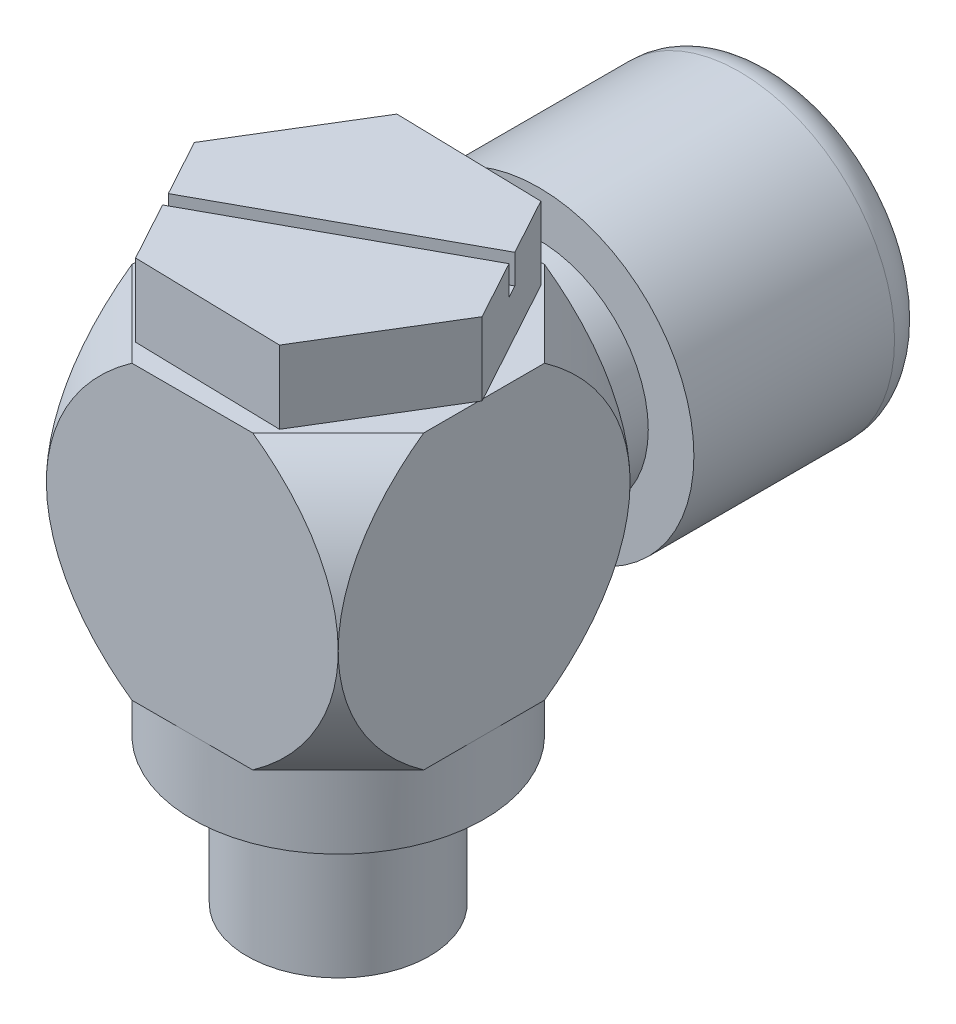
ISO-10303-21;
HEADER;
FILE_DESCRIPTION(('STEP AP214'),'2;1');
FILE_NAME('part.step','',(''),(''),'','','');
FILE_SCHEMA(('AUTOMOTIVE_DESIGN { 1 0 10303 214 1 1 1 1 }'));
ENDSEC;
DATA;
#1=APPLICATION_CONTEXT('core data for automotive mechanical design processes');
#2=APPLICATION_PROTOCOL_DEFINITION('international standard','automotive_design',2000,#1);
#3=PRODUCT_CONTEXT('',#1,'mechanical');
#4=PRODUCT('Part','Part','',(#3));
#5=PRODUCT_RELATED_PRODUCT_CATEGORY('part','',(#4));
#6=PRODUCT_DEFINITION_FORMATION('','',#4);
#7=PRODUCT_DEFINITION_CONTEXT('part definition',#1,'design');
#8=PRODUCT_DEFINITION('design','',#6,#7);
#9=PRODUCT_DEFINITION_SHAPE('','',#8);
#10=(LENGTH_UNIT() NAMED_UNIT(*) SI_UNIT(.MILLI.,.METRE.));
#11=(NAMED_UNIT(*) PLANE_ANGLE_UNIT() SI_UNIT($,.RADIAN.));
#12=(NAMED_UNIT(*) SI_UNIT($,.STERADIAN.) SOLID_ANGLE_UNIT());
#13=UNCERTAINTY_MEASURE_WITH_UNIT(LENGTH_MEASURE(1.E-05),#10,'distance_accuracy_value','');
#14=(GEOMETRIC_REPRESENTATION_CONTEXT(3) GLOBAL_UNCERTAINTY_ASSIGNED_CONTEXT((#13)) GLOBAL_UNIT_ASSIGNED_CONTEXT((#10,
#11,#12)) REPRESENTATION_CONTEXT('',''));
#15=CARTESIAN_POINT('',(0.,0.,0.));
#16=DIRECTION('',(0.,0.,1.));
#17=DIRECTION('',(1.,0.,0.));
#18=AXIS2_PLACEMENT_3D('',#15,#16,#17);
#19=CARTESIAN_POINT('',(1.35007971637512,-3.43907363420428,7.64251311566957));
#20=DIRECTION('',(0.,1.,0.));
#21=DIRECTION('',(0.,0.,1.));
#22=AXIS2_PLACEMENT_3D('',#19,#20,#21);
#23=PLANE('',#22);
#24=DIRECTION('',(0.877617924580816,0.,-0.479360801958672));
#25=VECTOR('',#24,1.);
#26=CARTESIAN_POINT('',(-1.47617054158178,-3.43907363420428,2.46818956731241));
#27=LINE('',#26,#25);
#28=CARTESIAN_POINT('',(-7.61949601364746,-3.43907363420428,5.8237151810231));
#29=VERTEX_POINT('',#28);
#30=CARTESIAN_POINT('',(-1.47617054158178,-3.43907363420428,2.46818956731241));
#31=VERTEX_POINT('',#30);
#32=EDGE_CURVE('E40',#29,#31,#27,.T.);
#33=ORIENTED_EDGE('',*,*,#32,.F.);
#34=DIRECTION('',(0.479360801958672,0.,0.877617924580816));
#35=VECTOR('',#34,1.);
#36=CARTESIAN_POINT('',(-8.66787298838766,-3.43907363420428,3.90433749934705));
#37=LINE('',#36,#35);
#38=CARTESIAN_POINT('',(-6.73055937203911,-3.43907363420428,7.45118811436365));
#39=VERTEX_POINT('',#38);
#40=EDGE_CURVE('E229',#29,#39,#37,.T.);
#41=ORIENTED_EDGE('',*,*,#40,.T.);
#42=DIRECTION('',(0.999719818482898,0.,0.0236703302157165));
#43=VECTOR('',#42,1.);
#44=CARTESIAN_POINT('',(-6.73055937203911,-3.43907363420428,7.45118811436365));
#45=LINE('',#44,#43);
#46=CARTESIAN_POINT('',(-2.690239827832,-3.43907363420428,7.54685061501661));
#47=VERTEX_POINT('',#46);
#48=EDGE_CURVE('E366',#39,#47,#45,.T.);
#49=ORIENTED_EDGE('',*,*,#48,.T.);
#50=DIRECTION('',(0.520359016524226,0.,-0.853947594365099));
#51=VECTOR('',#50,1.);
#52=CARTESIAN_POINT('',(-2.690239827832,-3.43907363420428,7.54685061501661));
#53=LINE('',#52,#51);
#54=CARTESIAN_POINT('',(-0.587233899973428,-3.43907363420428,4.09566250065296));
#55=VERTEX_POINT('',#54);
#56=EDGE_CURVE('E359',#47,#55,#53,.T.);
#57=ORIENTED_EDGE('',*,*,#56,.T.);
#58=DIRECTION('',(-0.479360801958672,0.,-0.877617924580816));
#59=VECTOR('',#58,1.);
#60=CARTESIAN_POINT('',(-0.587233899973428,-3.43907363420428,4.09566250065296));
#61=LINE('',#60,#59);
#62=EDGE_CURVE('E355',#55,#31,#61,.T.);
#63=ORIENTED_EDGE('',*,*,#62,.T.);
#64=EDGE_LOOP('',(#33,#41,#49,#57,#63));
#65=FACE_BOUND('',#64,.T.);
#66=ADVANCED_FACE('F32',(#65),#23,.T.);
#67=CARTESIAN_POINT('',(-8.62755344418053,-13.4390736342043,0.));
#68=DIRECTION('',(0.,0.,1.));
#69=DIRECTION('',(1.,0.,0.));
#70=AXIS2_PLACEMENT_3D('',#67,#68,#69);
#71=PLANE('',#70);
#72=CARTESIAN_POINT('',(-8.62755344418049,-9.43907363420428,0.));
#73=DIRECTION('',(0.,0.,1.));
#74=DIRECTION('',(1.,0.,0.));
#75=AXIS2_PLACEMENT_3D('',#72,#73,#74);
#76=ELLIPSE('',#75,7.99999999999995,5.65685424949235);
#77=CARTESIAN_POINT('',(-0.627553444180534,-9.43907363420428,0.));
#78=VERTEX_POINT('',#77);
#79=CARTESIAN_POINT('',(-2.97069919468817,-5.43907363420428,0.));
#80=VERTEX_POINT('',#79);
#81=EDGE_CURVE('E332',#78,#80,#76,.T.);
#82=ORIENTED_EDGE('',*,*,#81,.F.);
#83=CARTESIAN_POINT('',(-2.97069919468817,-13.4390736342043,0.));
#84=VERTEX_POINT('',#83);
#85=EDGE_CURVE('E329',#84,#78,#76,.T.);
#86=ORIENTED_EDGE('',*,*,#85,.F.);
#87=DIRECTION('',(1.,0.,0.));
#88=VECTOR('',#87,1.);
#89=CARTESIAN_POINT('',(-8.62755344418053,-13.4390736342043,0.));
#90=LINE('',#89,#88);
#91=CARTESIAN_POINT('',(-4.62755344418047,-13.4390736342043,0.));
#92=VERTEX_POINT('',#91);
#93=EDGE_CURVE('E296',#92,#84,#90,.T.);
#94=ORIENTED_EDGE('',*,*,#93,.F.);
#95=CARTESIAN_POINT('',(-6.28440769367293,-13.4390736342043,0.));
#96=VERTEX_POINT('',#95);
#97=EDGE_CURVE('E298',#96,#92,#90,.T.);
#98=ORIENTED_EDGE('',*,*,#97,.F.);
#99=CARTESIAN_POINT('',(-0.627553444180537,-9.43907363420428,0.));
#100=DIRECTION('',(0.,0.,1.));
#101=DIRECTION('',(1.,0.,0.));
#102=AXIS2_PLACEMENT_3D('',#99,#100,#101);
#103=ELLIPSE('',#102,8.,5.65685424949239);
#104=CARTESIAN_POINT('',(-8.62755344418054,-9.43907363420428,0.));
#105=VERTEX_POINT('',#104);
#106=EDGE_CURVE('E326',#105,#96,#103,.T.);
#107=ORIENTED_EDGE('',*,*,#106,.F.);
#108=CARTESIAN_POINT('',(-6.28440769367293,-5.43907363420428,0.));
#109=VERTEX_POINT('',#108);
#110=EDGE_CURVE('E328',#109,#105,#103,.T.);
#111=ORIENTED_EDGE('',*,*,#110,.F.);
#112=DIRECTION('',(-1.,0.,0.));
#113=VECTOR('',#112,1.);
#114=CARTESIAN_POINT('',(-8.62755344418053,-5.43907363420428,0.));
#115=LINE('',#114,#113);
#116=EDGE_CURVE('E300',#80,#109,#115,.T.);
#117=ORIENTED_EDGE('',*,*,#116,.F.);
#118=EDGE_LOOP('',(#82,#86,#94,#98,#107,#111,#117));
#119=FACE_BOUND('',#118,.T.);
#120=CARTESIAN_POINT('',(-4.62755344418055,-9.43907363420428,0.));
#121=DIRECTION('',(0.,0.,1.));
#122=DIRECTION('',(1.,0.,0.));
#123=AXIS2_PLACEMENT_3D('',#120,#121,#122);
#124=CIRCLE('',#123,3.);
#125=CARTESIAN_POINT('',(-1.62755344418055,-9.43907363420428,0.));
#126=VERTEX_POINT('',#125);
#127=EDGE_CURVE('E333',#126,#126,#124,.F.);
#128=ORIENTED_EDGE('',*,*,#127,.F.);
#129=EDGE_LOOP('',(#128));
#130=FACE_BOUND('',#129,.T.);
#131=ADVANCED_FACE('F446',(#119,#130),#71,.F.);
#132=CARTESIAN_POINT('',(-4.62755344418047,-15.4390736342043,4.00000000000008));
#133=DIRECTION('',(0.,-1.,0.));
#134=DIRECTION('',(0.,0.,-1.));
#135=AXIS2_PLACEMENT_3D('',#132,#133,#134);
#136=PLANE('',#135);
#137=CARTESIAN_POINT('',(-4.62755344418047,-15.4390736342043,4.00000000000008));
#138=DIRECTION('',(0.,-1.,0.));
#139=DIRECTION('',(0.,0.,-1.));
#140=AXIS2_PLACEMENT_3D('',#137,#138,#139);
#141=CIRCLE('',#140,4.00000000000011);
#142=CARTESIAN_POINT('',(-4.62755344418047,-15.4390736342043,0.));
#143=VERTEX_POINT('',#142);
#144=EDGE_CURVE('E390',#143,#143,#141,.T.);
#145=ORIENTED_EDGE('',*,*,#144,.T.);
#146=EDGE_LOOP('',(#145));
#147=FACE_BOUND('',#146,.T.);
#148=CARTESIAN_POINT('',(-4.62755344418047,-15.4390736342043,4.00000000000008));
#149=DIRECTION('',(0.,-1.,0.));
#150=DIRECTION('',(0.,0.,-1.));
#151=AXIS2_PLACEMENT_3D('',#148,#149,#150);
#152=CIRCLE('',#151,2.5);
#153=CARTESIAN_POINT('',(-4.62755344418047,-15.4390736342043,1.50000000000008));
#154=VERTEX_POINT('',#153);
#155=EDGE_CURVE('E400',#154,#154,#152,.T.);
#156=ORIENTED_EDGE('',*,*,#155,.F.);
#157=EDGE_LOOP('',(#156));
#158=FACE_BOUND('',#157,.T.);
#159=ADVANCED_FACE('F540',(#147,#158),#136,.T.);
#160=CARTESIAN_POINT('',(-8.62755344418053,-13.4390736342043,8.));
#161=DIRECTION('',(0.,1.,0.));
#162=DIRECTION('',(0.,0.,1.));
#163=AXIS2_PLACEMENT_3D('',#160,#161,#162);
#164=PLANE('',#163);
#165=CARTESIAN_POINT('',(-4.62755344418047,-13.4390736342043,4.00000000000008));
#166=DIRECTION('',(0.,-1.,0.));
#167=DIRECTION('',(0.,0.,-1.));
#168=AXIS2_PLACEMENT_3D('',#165,#166,#167);
#169=CIRCLE('',#168,4.00000000000011);
#170=CARTESIAN_POINT('',(-1.79912631943428,-13.4390736342043,1.17157287525389));
#171=VERTEX_POINT('',#170);
#172=EDGE_CURVE('E393',#92,#171,#169,.T.);
#173=ORIENTED_EDGE('',*,*,#172,.F.);
#174=ORIENTED_EDGE('',*,*,#93,.T.);
#175=DIRECTION('',(0.707106781186547,0.,0.707106781186548));
#176=VECTOR('',#175,1.);
#177=CARTESIAN_POINT('',(-8.16308735011327,-13.4390736342043,-5.19238815542511));
#178=LINE('',#177,#176);
#179=EDGE_CURVE('E255',#171,#84,#178,.F.);
#180=ORIENTED_EDGE('',*,*,#179,.F.);
#181=EDGE_LOOP('',(#173,#174,#180));
#182=FACE_BOUND('',#181,.T.);
#183=ADVANCED_FACE('F487',(#182),#164,.F.);
#184=CARTESIAN_POINT('',(-0.627553444180535,-13.4390736342043,4.00000000000008));
#185=VERTEX_POINT('',#184);
#186=EDGE_CURVE('E337',#171,#185,#169,.T.);
#187=ORIENTED_EDGE('',*,*,#186,.F.);
#188=CARTESIAN_POINT('',(-0.627553444180536,-13.4390736342043,2.34314575050763));
#189=VERTEX_POINT('',#188);
#190=EDGE_CURVE('E257',#189,#171,#178,.F.);
#191=ORIENTED_EDGE('',*,*,#190,.F.);
#192=DIRECTION('',(0.,0.,-1.));
#193=VECTOR('',#192,1.);
#194=CARTESIAN_POINT('',(-0.627553444180535,-13.4390736342043,8.));
#195=LINE('',#194,#193);
#196=EDGE_CURVE('E317',#185,#189,#195,.T.);
#197=ORIENTED_EDGE('',*,*,#196,.F.);
#198=EDGE_LOOP('',(#187,#191,#197));
#199=FACE_BOUND('',#198,.T.);
#200=ADVANCED_FACE('F484',(#199),#164,.F.);
#201=CARTESIAN_POINT('',(-1.79912631943433,-13.4390736342043,6.82842712474621));
#202=VERTEX_POINT('',#201);
#203=EDGE_CURVE('E476',#185,#202,#169,.T.);
#204=ORIENTED_EDGE('',*,*,#203,.F.);
#205=CARTESIAN_POINT('',(-0.627553444180535,-13.4390736342043,5.65685424949241));
#206=VERTEX_POINT('',#205);
#207=EDGE_CURVE('E319',#206,#185,#195,.T.);
#208=ORIENTED_EDGE('',*,*,#207,.F.);
#209=DIRECTION('',(0.707106781186546,0.,-0.707106781186549));
#210=VECTOR('',#209,1.);
#211=CARTESIAN_POINT('',(-8.16308735011325,-13.4390736342043,13.1923881554252));
#212=LINE('',#211,#210);
#213=EDGE_CURVE('E297',#202,#206,#212,.T.);
#214=ORIENTED_EDGE('',*,*,#213,.F.);
#215=EDGE_LOOP('',(#204,#208,#214));
#216=FACE_BOUND('',#215,.T.);
#217=ADVANCED_FACE('F501',(#216),#164,.F.);
#218=CARTESIAN_POINT('',(-4.62755344418047,-13.4390736342043,8.));
#219=VERTEX_POINT('',#218);
#220=EDGE_CURVE('E475',#202,#219,#169,.T.);
#221=ORIENTED_EDGE('',*,*,#220,.F.);
#222=CARTESIAN_POINT('',(-2.97069919468812,-13.4390736342043,8.));
#223=VERTEX_POINT('',#222);
#224=EDGE_CURVE('E293',#223,#202,#212,.T.);
#225=ORIENTED_EDGE('',*,*,#224,.F.);
#226=DIRECTION('',(1.,0.,0.));
#227=VECTOR('',#226,1.);
#228=CARTESIAN_POINT('',(-8.62755344418053,-13.4390736342043,8.));
#229=LINE('',#228,#227);
#230=EDGE_CURVE('E302',#219,#223,#229,.T.);
#231=ORIENTED_EDGE('',*,*,#230,.F.);
#232=EDGE_LOOP('',(#221,#225,#231));
#233=FACE_BOUND('',#232,.T.);
#234=ADVANCED_FACE('F507',(#233),#164,.F.);
#235=CARTESIAN_POINT('',(-7.45598056892661,-13.4390736342043,6.82842712474621));
#236=VERTEX_POINT('',#235);
#237=EDGE_CURVE('E55',#219,#236,#169,.T.);
#238=ORIENTED_EDGE('',*,*,#237,.F.);
#239=CARTESIAN_POINT('',(-6.28440769367283,-13.4390736342043,8.));
#240=VERTEX_POINT('',#239);
#241=EDGE_CURVE('E303',#240,#219,#229,.T.);
#242=ORIENTED_EDGE('',*,*,#241,.F.);
#243=DIRECTION('',(0.707106781186547,0.,0.707106781186548));
#244=VECTOR('',#243,1.);
#245=CARTESIAN_POINT('',(-13.8199415996056,-13.4390736342043,0.46446609406721));
#246=LINE('',#245,#244);
#247=EDGE_CURVE('E266',#236,#240,#246,.T.);
#248=ORIENTED_EDGE('',*,*,#247,.F.);
#249=EDGE_LOOP('',(#238,#242,#248));
#250=FACE_BOUND('',#249,.T.);
#251=ADVANCED_FACE('F512',(#250),#164,.F.);
#252=CARTESIAN_POINT('',(-8.62755344418053,-13.4390736342043,4.00000000000008));
#253=VERTEX_POINT('',#252);
#254=EDGE_CURVE('E472',#236,#253,#169,.T.);
#255=ORIENTED_EDGE('',*,*,#254,.F.);
#256=CARTESIAN_POINT('',(-8.62755344418053,-13.4390736342043,5.65685424949229));
#257=VERTEX_POINT('',#256);
#258=EDGE_CURVE('E267',#257,#236,#246,.T.);
#259=ORIENTED_EDGE('',*,*,#258,.F.);
#260=DIRECTION('',(0.,0.,-1.));
#261=VECTOR('',#260,1.);
#262=CARTESIAN_POINT('',(-8.62755344418053,-13.4390736342043,8.));
#263=LINE('',#262,#261);
#264=EDGE_CURVE('E323',#257,#253,#263,.T.);
#265=ORIENTED_EDGE('',*,*,#264,.T.);
#266=EDGE_LOOP('',(#255,#259,#265));
#267=FACE_BOUND('',#266,.T.);
#268=ADVANCED_FACE('F471',(#267),#164,.F.);
#269=CARTESIAN_POINT('',(-7.45598056892675,-13.4390736342043,1.17157287525382));
#270=VERTEX_POINT('',#269);
#271=EDGE_CURVE('E462',#253,#270,#169,.T.);
#272=ORIENTED_EDGE('',*,*,#271,.F.);
#273=CARTESIAN_POINT('',(-8.62755344418053,-13.4390736342043,2.34314575050761));
#274=VERTEX_POINT('',#273);
#275=EDGE_CURVE('E322',#253,#274,#263,.T.);
#276=ORIENTED_EDGE('',*,*,#275,.T.);
#277=DIRECTION('',(0.707106781186546,0.,-0.707106781186549));
#278=VECTOR('',#277,1.);
#279=CARTESIAN_POINT('',(-13.8199415996057,-13.4390736342043,7.53553390593276));
#280=LINE('',#279,#278);
#281=EDGE_CURVE('E276',#270,#274,#280,.F.);
#282=ORIENTED_EDGE('',*,*,#281,.F.);
#283=EDGE_LOOP('',(#272,#276,#282));
#284=FACE_BOUND('',#283,.T.);
#285=ADVANCED_FACE('F465',(#284),#164,.F.);
#286=EDGE_CURVE('E397',#270,#92,#169,.T.);
#287=ORIENTED_EDGE('',*,*,#286,.F.);
#288=EDGE_CURVE('E277',#96,#270,#280,.F.);
#289=ORIENTED_EDGE('',*,*,#288,.F.);
#290=ORIENTED_EDGE('',*,*,#97,.T.);
#291=EDGE_LOOP('',(#287,#289,#290));
#292=FACE_BOUND('',#291,.T.);
#293=ADVANCED_FACE('F458',(#292),#164,.F.);
#294=CARTESIAN_POINT('',(-8.62755344418053,-5.43907363420428,8.));
#295=DIRECTION('',(0.,-1.,0.));
#296=DIRECTION('',(0.,0.,-1.));
#297=AXIS2_PLACEMENT_3D('',#294,#295,#296);
#298=PLANE('',#297);
#299=DIRECTION('',(-0.520359016524226,0.,0.853947594365099));
#300=VECTOR('',#299,1.);
#301=CARTESIAN_POINT('',(-6.5648670605291,-5.43907363420428,0.453149384983397));
#302=LINE('',#301,#300);
#303=CARTESIAN_POINT('',(-6.5648670605291,-5.43907363420428,0.453149384983397));
#304=VERTEX_POINT('',#303);
#305=CARTESIAN_POINT('',(-8.62755344418053,-5.43907363420428,3.83817014817562));
#306=VERTEX_POINT('',#305);
#307=EDGE_CURVE('E371',#304,#306,#302,.T.);
#308=ORIENTED_EDGE('',*,*,#307,.F.);
#309=DIRECTION('',(-0.999719818482898,0.,-0.0236703302157167));
#310=VECTOR('',#309,1.);
#311=CARTESIAN_POINT('',(-2.52454751632198,-5.43907363420428,0.548811885636356));
#312=LINE('',#311,#310);
#313=CARTESIAN_POINT('',(-2.52454751632198,-5.43907363420428,0.548811885636356));
#314=VERTEX_POINT('',#313);
#315=EDGE_CURVE('E376',#314,#304,#312,.T.);
#316=ORIENTED_EDGE('',*,*,#315,.F.);
#317=DIRECTION('',(-0.479360801958672,0.,-0.877617924580816));
#318=VECTOR('',#317,1.);
#319=CARTESIAN_POINT('',(-0.587233899973428,-5.43907363420428,4.09566250065296));
#320=LINE('',#319,#318);
#321=CARTESIAN_POINT('',(-0.627553444180536,-5.43907363420428,4.02184512851385));
#322=VERTEX_POINT('',#321);
#323=EDGE_CURVE('E383',#322,#314,#320,.T.);
#324=ORIENTED_EDGE('',*,*,#323,.F.);
#325=DIRECTION('',(0.,0.,-1.));
#326=VECTOR('',#325,1.);
#327=CARTESIAN_POINT('',(-0.627553444180535,-5.43907363420428,8.));
#328=LINE('',#327,#326);
#329=CARTESIAN_POINT('',(-0.627553444180536,-5.43907363420428,2.34314575050763));
#330=VERTEX_POINT('',#329);
#331=EDGE_CURVE('E313',#322,#330,#328,.T.);
#332=ORIENTED_EDGE('',*,*,#331,.T.);
#333=DIRECTION('',(0.707106781186547,0.,0.707106781186548));
#334=VECTOR('',#333,1.);
#335=CARTESIAN_POINT('',(-8.16308735011327,-5.43907363420428,-5.19238815542511));
#336=LINE('',#335,#334);
#337=EDGE_CURVE('E250',#80,#330,#336,.T.);
#338=ORIENTED_EDGE('',*,*,#337,.F.);
#339=ORIENTED_EDGE('',*,*,#116,.T.);
#340=DIRECTION('',(0.707106781186546,0.,-0.707106781186549));
#341=VECTOR('',#340,1.);
#342=CARTESIAN_POINT('',(-13.8199415996057,-5.43907363420428,7.53553390593276));
#343=LINE('',#342,#341);
#344=CARTESIAN_POINT('',(-8.62755344418053,-5.43907363420428,2.34314575050761));
#345=VERTEX_POINT('',#344);
#346=EDGE_CURVE('E273',#345,#109,#343,.T.);
#347=ORIENTED_EDGE('',*,*,#346,.F.);
#348=DIRECTION('',(0.,0.,-1.));
#349=VECTOR('',#348,1.);
#350=CARTESIAN_POINT('',(-8.62755344418053,-5.43907363420428,8.));
#351=LINE('',#350,#349);
#352=EDGE_CURVE('E309',#306,#345,#351,.T.);
#353=ORIENTED_EDGE('',*,*,#352,.F.);
#354=EDGE_LOOP('',(#308,#316,#324,#332,#338,#339,#347,#353));
#355=FACE_BOUND('',#354,.T.);
#356=ADVANCED_FACE('F441',(#355),#298,.F.);
#357=DIRECTION('',(0.479360801958672,0.,0.877617924580816));
#358=VECTOR('',#357,1.);
#359=CARTESIAN_POINT('',(-8.66787298838766,-5.43907363420428,3.90433749934705));
#360=LINE('',#359,#358);
#361=CARTESIAN_POINT('',(-8.62755344418053,-5.43907363420428,3.97815487148619));
#362=VERTEX_POINT('',#361);
#363=CARTESIAN_POINT('',(-6.73055937203911,-5.43907363420428,7.45118811436365));
#364=VERTEX_POINT('',#363);
#365=EDGE_CURVE('E372',#362,#364,#360,.T.);
#366=ORIENTED_EDGE('',*,*,#365,.F.);
#367=CARTESIAN_POINT('',(-8.62755344418053,-5.43907363420428,5.65685424949229));
#368=VERTEX_POINT('',#367);
#369=EDGE_CURVE('E310',#368,#362,#351,.T.);
#370=ORIENTED_EDGE('',*,*,#369,.F.);
#371=DIRECTION('',(0.707106781186547,0.,0.707106781186548));
#372=VECTOR('',#371,1.);
#373=CARTESIAN_POINT('',(-13.8199415996056,-5.43907363420428,0.46446609406721));
#374=LINE('',#373,#372);
#375=CARTESIAN_POINT('',(-6.28440769367283,-5.43907363420428,8.));
#376=VERTEX_POINT('',#375);
#377=EDGE_CURVE('E264',#376,#368,#374,.F.);
#378=ORIENTED_EDGE('',*,*,#377,.F.);
#379=DIRECTION('',(-1.,0.,0.));
#380=VECTOR('',#379,1.);
#381=CARTESIAN_POINT('',(-8.62755344418053,-5.43907363420428,8.));
#382=LINE('',#381,#380);
#383=CARTESIAN_POINT('',(-2.97069919468812,-5.43907363420428,8.));
#384=VERTEX_POINT('',#383);
#385=EDGE_CURVE('E306',#384,#376,#382,.T.);
#386=ORIENTED_EDGE('',*,*,#385,.F.);
#387=DIRECTION('',(0.707106781186546,0.,-0.707106781186549));
#388=VECTOR('',#387,1.);
#389=CARTESIAN_POINT('',(-8.16308735011325,-5.43907363420428,13.1923881554252));
#390=LINE('',#389,#388);
#391=CARTESIAN_POINT('',(-0.627553444180535,-5.43907363420428,5.65685424949241));
#392=VERTEX_POINT('',#391);
#393=EDGE_CURVE('E288',#392,#384,#390,.F.);
#394=ORIENTED_EDGE('',*,*,#393,.F.);
#395=CARTESIAN_POINT('',(-0.627553444180536,-5.43907363420428,4.16182985182435));
#396=VERTEX_POINT('',#395);
#397=EDGE_CURVE('E315',#392,#396,#328,.T.);
#398=ORIENTED_EDGE('',*,*,#397,.T.);
#399=DIRECTION('',(0.520359016524226,0.,-0.853947594365099));
#400=VECTOR('',#399,1.);
#401=CARTESIAN_POINT('',(-2.690239827832,-5.43907363420428,7.54685061501661));
#402=LINE('',#401,#400);
#403=CARTESIAN_POINT('',(-2.690239827832,-5.43907363420428,7.54685061501661));
#404=VERTEX_POINT('',#403);
#405=EDGE_CURVE('E382',#404,#396,#402,.T.);
#406=ORIENTED_EDGE('',*,*,#405,.F.);
#407=DIRECTION('',(0.999719818482898,0.,0.0236703302157165));
#408=VECTOR('',#407,1.);
#409=CARTESIAN_POINT('',(-6.73055937203911,-5.43907363420428,7.45118811436365));
#410=LINE('',#409,#408);
#411=EDGE_CURVE('E387',#364,#404,#410,.T.);
#412=ORIENTED_EDGE('',*,*,#411,.F.);
#413=EDGE_LOOP('',(#366,#370,#378,#386,#394,#398,#406,#412));
#414=FACE_BOUND('',#413,.T.);
#415=ADVANCED_FACE('F520',(#414),#298,.F.);
#416=CARTESIAN_POINT('',(-8.62755344418053,-5.43907363420428,8.));
#417=DIRECTION('',(1.,0.,0.));
#418=DIRECTION('',(0.,0.,-1.));
#419=AXIS2_PLACEMENT_3D('',#416,#417,#418);
#420=PLANE('',#419);
#421=CARTESIAN_POINT('',(-8.62755344418053,-9.43907363420428,0.));
#422=DIRECTION('',(1.,0.,0.));
#423=DIRECTION('',(0.,0.,1.));
#424=AXIS2_PLACEMENT_3D('',#421,#422,#423);
#425=ELLIPSE('',#424,7.99999999999997,5.65685424949235);
#426=CARTESIAN_POINT('',(-8.62755344418046,-9.43907363420428,8.));
#427=VERTEX_POINT('',#426);
#428=EDGE_CURVE('E272',#427,#257,#425,.T.);
#429=ORIENTED_EDGE('',*,*,#428,.F.);
#430=EDGE_CURVE('E270',#368,#427,#425,.T.);
#431=ORIENTED_EDGE('',*,*,#430,.F.);
#432=ORIENTED_EDGE('',*,*,#369,.T.);
#433=EDGE_CURVE('E314',#362,#306,#351,.T.);
#434=ORIENTED_EDGE('',*,*,#433,.T.);
#435=ORIENTED_EDGE('',*,*,#352,.T.);
#436=CARTESIAN_POINT('',(-8.62755344418053,-9.43907363420428,8.00000000000003));
#437=DIRECTION('',(1.,0.,0.));
#438=DIRECTION('',(0.,0.,-1.));
#439=AXIS2_PLACEMENT_3D('',#436,#437,#438);
#440=ELLIPSE('',#439,8.00000000000003,5.65685424949239);
#441=EDGE_CURVE('E283',#105,#345,#440,.T.);
#442=ORIENTED_EDGE('',*,*,#441,.F.);
#443=EDGE_CURVE('E280',#274,#105,#440,.T.);
#444=ORIENTED_EDGE('',*,*,#443,.F.);
#445=ORIENTED_EDGE('',*,*,#275,.F.);
#446=ORIENTED_EDGE('',*,*,#264,.F.);
#447=EDGE_LOOP('',(#429,#431,#432,#434,#435,#442,#444,#445,#446));
#448=FACE_BOUND('',#447,.T.);
#449=ADVANCED_FACE('F34',(#448),#420,.F.);
#450=CARTESIAN_POINT('',(-0.627553444180535,-5.43907363420428,8.));
#451=DIRECTION('',(-1.,0.,0.));
#452=DIRECTION('',(0.,0.,1.));
#453=AXIS2_PLACEMENT_3D('',#450,#451,#452);
#454=PLANE('',#453);
#455=CARTESIAN_POINT('',(-0.627553444180535,-9.43907363420428,7.99999999999997));
#456=DIRECTION('',(-1.,0.,0.));
#457=DIRECTION('',(0.,0.,1.));
#458=AXIS2_PLACEMENT_3D('',#455,#456,#457);
#459=ELLIPSE('',#458,7.99999999999997,5.65685424949235);
#460=EDGE_CURVE('E253',#330,#78,#459,.T.);
#461=ORIENTED_EDGE('',*,*,#460,.F.);
#462=ORIENTED_EDGE('',*,*,#331,.F.);
#463=EDGE_CURVE('E318',#396,#322,#328,.T.);
#464=ORIENTED_EDGE('',*,*,#463,.F.);
#465=ORIENTED_EDGE('',*,*,#397,.F.);
#466=CARTESIAN_POINT('',(-0.627553444180535,-9.43907363420428,0.));
#467=DIRECTION('',(-1.,0.,0.));
#468=DIRECTION('',(0.,0.,-1.));
#469=AXIS2_PLACEMENT_3D('',#466,#467,#468);
#470=ELLIPSE('',#469,8.00000000000003,5.65685424949239);
#471=CARTESIAN_POINT('',(-0.627553444180508,-9.43907363420428,8.));
#472=VERTEX_POINT('',#471);
#473=EDGE_CURVE('E290',#472,#392,#470,.T.);
#474=ORIENTED_EDGE('',*,*,#473,.F.);
#475=EDGE_CURVE('E292',#206,#472,#470,.T.);
#476=ORIENTED_EDGE('',*,*,#475,.F.);
#477=ORIENTED_EDGE('',*,*,#207,.T.);
#478=ORIENTED_EDGE('',*,*,#196,.T.);
#479=EDGE_CURVE('E256',#78,#189,#459,.T.);
#480=ORIENTED_EDGE('',*,*,#479,.F.);
#481=EDGE_LOOP('',(#461,#462,#464,#465,#474,#476,#477,#478,#480));
#482=FACE_BOUND('',#481,.T.);
#483=ADVANCED_FACE('F493',(#482),#454,.F.);
#484=CARTESIAN_POINT('',(-8.62755344418053,-13.4390736342043,8.));
#485=DIRECTION('',(0.,0.,1.));
#486=DIRECTION('',(1.,0.,0.));
#487=AXIS2_PLACEMENT_3D('',#484,#485,#486);
#488=PLANE('',#487);
#489=ORIENTED_EDGE('',*,*,#385,.T.);
#490=CARTESIAN_POINT('',(-0.627553444180504,-9.43907363420428,8.));
#491=DIRECTION('',(0.,0.,1.));
#492=DIRECTION('',(1.,0.,0.));
#493=AXIS2_PLACEMENT_3D('',#490,#491,#492);
#494=ELLIPSE('',#493,7.99999999999995,5.65685424949235);
#495=EDGE_CURVE('E263',#376,#427,#494,.T.);
#496=ORIENTED_EDGE('',*,*,#495,.T.);
#497=EDGE_CURVE('E260',#427,#240,#494,.T.);
#498=ORIENTED_EDGE('',*,*,#497,.T.);
#499=ORIENTED_EDGE('',*,*,#241,.T.);
#500=ORIENTED_EDGE('',*,*,#230,.T.);
#501=CARTESIAN_POINT('',(-8.62755344418051,-9.43907363420428,8.));
#502=DIRECTION('',(0.,0.,1.));
#503=DIRECTION('',(1.,0.,0.));
#504=AXIS2_PLACEMENT_3D('',#501,#502,#503);
#505=ELLIPSE('',#504,8.,5.65685424949239);
#506=EDGE_CURVE('E284',#223,#472,#505,.T.);
#507=ORIENTED_EDGE('',*,*,#506,.T.);
#508=EDGE_CURVE('E287',#472,#384,#505,.T.);
#509=ORIENTED_EDGE('',*,*,#508,.T.);
#510=EDGE_LOOP('',(#489,#496,#498,#499,#500,#507,#509));
#511=FACE_BOUND('',#510,.T.);
#512=ADVANCED_FACE('F509',(#511),#488,.T.);
#513=CARTESIAN_POINT('',(-10.9915144748595,-9.43907363420428,10.363961030679));
#514=DIRECTION('',(0.707106781186546,0.,-0.707106781186549));
#515=DIRECTION('',(-0.707106781186549,0.,-0.707106781186546));
#516=AXIS2_PLACEMENT_3D('',#513,#514,#515);
#517=CYLINDRICAL_SURFACE('',#516,5.65685424949239);
#518=ORIENTED_EDGE('',*,*,#443,.T.);
#519=ORIENTED_EDGE('',*,*,#106,.T.);
#520=ORIENTED_EDGE('',*,*,#288,.T.);
#521=ORIENTED_EDGE('',*,*,#281,.T.);
#522=EDGE_LOOP('',(#518,#519,#520,#521));
#523=FACE_BOUND('',#522,.T.);
#524=ADVANCED_FACE('F455',(#523),#517,.T.);
#525=ORIENTED_EDGE('',*,*,#441,.T.);
#526=ORIENTED_EDGE('',*,*,#346,.T.);
#527=ORIENTED_EDGE('',*,*,#110,.T.);
#528=EDGE_LOOP('',(#525,#526,#527));
#529=FACE_BOUND('',#528,.T.);
#530=ADVANCED_FACE('F439',(#529),#517,.T.);
#531=ORIENTED_EDGE('',*,*,#224,.T.);
#532=ORIENTED_EDGE('',*,*,#213,.T.);
#533=ORIENTED_EDGE('',*,*,#475,.T.);
#534=ORIENTED_EDGE('',*,*,#506,.F.);
#535=EDGE_LOOP('',(#531,#532,#533,#534));
#536=FACE_BOUND('',#535,.T.);
#537=ADVANCED_FACE('F505',(#536),#517,.T.);
#538=ORIENTED_EDGE('',*,*,#473,.T.);
#539=ORIENTED_EDGE('',*,*,#393,.T.);
#540=ORIENTED_EDGE('',*,*,#508,.F.);
#541=EDGE_LOOP('',(#538,#539,#540));
#542=FACE_BOUND('',#541,.T.);
#543=ADVANCED_FACE('F532',(#542),#517,.T.);
#544=CARTESIAN_POINT('',(-10.9915144748594,-9.43907363420428,-2.36396103067895));
#545=DIRECTION('',(0.707106781186547,0.,0.707106781186548));
#546=DIRECTION('',(0.707106781186548,0.,-0.707106781186547));
#547=AXIS2_PLACEMENT_3D('',#544,#545,#546);
#548=CYLINDRICAL_SURFACE('',#547,5.65685424949235);
#549=ORIENTED_EDGE('',*,*,#479,.T.);
#550=ORIENTED_EDGE('',*,*,#190,.T.);
#551=ORIENTED_EDGE('',*,*,#179,.T.);
#552=ORIENTED_EDGE('',*,*,#85,.T.);
#553=EDGE_LOOP('',(#549,#550,#551,#552));
#554=FACE_BOUND('',#553,.T.);
#555=ADVANCED_FACE('F490',(#554),#548,.T.);
#556=ORIENTED_EDGE('',*,*,#460,.T.);
#557=ORIENTED_EDGE('',*,*,#81,.T.);
#558=ORIENTED_EDGE('',*,*,#337,.T.);
#559=EDGE_LOOP('',(#556,#557,#558));
#560=FACE_BOUND('',#559,.T.);
#561=ADVANCED_FACE('F524',(#560),#548,.T.);
#562=ORIENTED_EDGE('',*,*,#428,.T.);
#563=ORIENTED_EDGE('',*,*,#258,.T.);
#564=ORIENTED_EDGE('',*,*,#247,.T.);
#565=ORIENTED_EDGE('',*,*,#497,.F.);
#566=EDGE_LOOP('',(#562,#563,#564,#565));
#567=FACE_BOUND('',#566,.T.);
#568=ADVANCED_FACE('F514',(#567),#548,.T.);
#569=ORIENTED_EDGE('',*,*,#430,.T.);
#570=ORIENTED_EDGE('',*,*,#495,.F.);
#571=ORIENTED_EDGE('',*,*,#377,.T.);
#572=EDGE_LOOP('',(#569,#570,#571));
#573=FACE_BOUND('',#572,.T.);
#574=ADVANCED_FACE('F531',(#573),#548,.T.);
#575=CARTESIAN_POINT('',(1.35007971637512,-5.43907363420428,7.64251311566957));
#576=DIRECTION('',(0.,1.,0.));
#577=DIRECTION('',(0.,0.,1.));
#578=AXIS2_PLACEMENT_3D('',#575,#576,#577);
#579=PLANE('',#578);
#580=CARTESIAN_POINT('',(-0.587233899973428,-5.43907363420428,4.09566250065296));
#581=VERTEX_POINT('',#580);
#582=EDGE_CURVE('E386',#396,#581,#402,.T.);
#583=ORIENTED_EDGE('',*,*,#582,.F.);
#584=ORIENTED_EDGE('',*,*,#463,.T.);
#585=EDGE_CURVE('E379',#581,#322,#320,.T.);
#586=ORIENTED_EDGE('',*,*,#585,.F.);
#587=EDGE_LOOP('',(#583,#584,#586));
#588=FACE_BOUND('',#587,.T.);
#589=ADVANCED_FACE('F549',(#588),#579,.F.);
#590=CARTESIAN_POINT('',(-6.73055937203911,-3.43907363420428,7.45118811436365));
#591=DIRECTION('',(0.0236703302157165,0.,-0.999719818482898));
#592=DIRECTION('',(-0.999719818482898,0.,-0.0236703302157165));
#593=AXIS2_PLACEMENT_3D('',#590,#591,#592);
#594=PLANE('',#593);
#595=ORIENTED_EDGE('',*,*,#411,.T.);
#596=DIRECTION('',(0.,-1.,0.));
#597=VECTOR('',#596,1.);
#598=CARTESIAN_POINT('',(-2.690239827832,-3.43907363420428,7.54685061501661));
#599=LINE('',#598,#597);
#600=EDGE_CURVE('E247',#47,#404,#599,.T.);
#601=ORIENTED_EDGE('',*,*,#600,.F.);
#602=ORIENTED_EDGE('',*,*,#48,.F.);
#603=DIRECTION('',(0.,-1.,0.));
#604=VECTOR('',#603,1.);
#605=CARTESIAN_POINT('',(-6.73055937203911,-3.43907363420428,7.45118811436365));
#606=LINE('',#605,#604);
#607=EDGE_CURVE('E228',#39,#364,#606,.T.);
#608=ORIENTED_EDGE('',*,*,#607,.T.);
#609=EDGE_LOOP('',(#595,#601,#602,#608));
#610=FACE_BOUND('',#609,.T.);
#611=ADVANCED_FACE('F561',(#610),#594,.F.);
#612=CARTESIAN_POINT('',(-2.690239827832,-3.43907363420428,7.54685061501661));
#613=DIRECTION('',(-0.853947594365099,0.,-0.520359016524226));
#614=DIRECTION('',(-0.520359016524226,0.,0.853947594365099));
#615=AXIS2_PLACEMENT_3D('',#612,#613,#614);
#616=PLANE('',#615);
#617=ORIENTED_EDGE('',*,*,#405,.T.);
#618=ORIENTED_EDGE('',*,*,#582,.T.);
#619=DIRECTION('',(0.,-1.,0.));
#620=VECTOR('',#619,1.);
#621=CARTESIAN_POINT('',(-0.587233899973428,-3.43907363420428,4.09566250065296));
#622=LINE('',#621,#620);
#623=EDGE_CURVE('E244',#55,#581,#622,.T.);
#624=ORIENTED_EDGE('',*,*,#623,.F.);
#625=ORIENTED_EDGE('',*,*,#56,.F.);
#626=ORIENTED_EDGE('',*,*,#600,.T.);
#627=EDGE_LOOP('',(#617,#618,#624,#625,#626));
#628=FACE_BOUND('',#627,.T.);
#629=ADVANCED_FACE('F559',(#628),#616,.F.);
#630=CARTESIAN_POINT('',(-0.587233899973428,-3.43907363420428,4.09566250065296));
#631=DIRECTION('',(-0.877617924580816,0.,0.479360801958672));
#632=DIRECTION('',(0.479360801958672,0.,0.877617924580816));
#633=AXIS2_PLACEMENT_3D('',#630,#631,#632);
#634=PLANE('',#633);
#635=DIRECTION('',(0.479360801958672,0.,0.877617924580816));
#636=VECTOR('',#635,1.);
#637=CARTESIAN_POINT('',(-0.587233899973428,-4.23907363420428,4.09566250065296));
#638=LINE('',#637,#636);
#639=CARTESIAN_POINT('',(-1.66712830090303,-4.23907363420428,2.11858244104478));
#640=VERTEX_POINT('',#639);
#641=CARTESIAN_POINT('',(-1.47617054158178,-4.23907363420428,2.46818956731241));
#642=VERTEX_POINT('',#641);
#643=EDGE_CURVE('E356',#640,#642,#638,.T.);
#644=ORIENTED_EDGE('',*,*,#643,.T.);
#645=DIRECTION('',(0.,1.,0.));
#646=VECTOR('',#645,1.);
#647=CARTESIAN_POINT('',(-1.47617054158178,-3.43907363420428,2.46818956731241));
#648=LINE('',#647,#646);
#649=EDGE_CURVE('E346',#642,#31,#648,.T.);
#650=ORIENTED_EDGE('',*,*,#649,.T.);
#651=ORIENTED_EDGE('',*,*,#62,.F.);
#652=ORIENTED_EDGE('',*,*,#623,.T.);
#653=ORIENTED_EDGE('',*,*,#585,.T.);
#654=ORIENTED_EDGE('',*,*,#323,.T.);
#655=DIRECTION('',(0.,-1.,0.));
#656=VECTOR('',#655,1.);
#657=CARTESIAN_POINT('',(-2.52454751632198,-3.43907363420428,0.548811885636356));
#658=LINE('',#657,#656);
#659=CARTESIAN_POINT('',(-2.52454751632198,-3.43907363420428,0.548811885636356));
#660=VERTEX_POINT('',#659);
#661=EDGE_CURVE('E241',#660,#314,#658,.T.);
#662=ORIENTED_EDGE('',*,*,#661,.F.);
#663=CARTESIAN_POINT('',(-1.66712830090303,-3.43907363420428,2.11858244104478));
#664=VERTEX_POINT('',#663);
#665=EDGE_CURVE('E362',#664,#660,#61,.T.);
#666=ORIENTED_EDGE('',*,*,#665,.F.);
#667=DIRECTION('',(0.,-1.,0.));
#668=VECTOR('',#667,1.);
#669=CARTESIAN_POINT('',(-1.66712830090303,-3.43907363420428,2.11858244104478));
#670=LINE('',#669,#668);
#671=EDGE_CURVE('E47',#664,#640,#670,.T.);
#672=ORIENTED_EDGE('',*,*,#671,.T.);
#673=EDGE_LOOP('',(#644,#650,#651,#652,#653,#654,#662,#666,#672));
#674=FACE_BOUND('',#673,.T.);
#675=ADVANCED_FACE('F354',(#674),#634,.F.);
#676=CARTESIAN_POINT('',(-2.52454751632198,-3.43907363420428,0.548811885636356));
#677=DIRECTION('',(-0.0236703302157167,0.,0.999719818482898));
#678=DIRECTION('',(0.999719818482898,0.,0.0236703302157167));
#679=AXIS2_PLACEMENT_3D('',#676,#677,#678);
#680=PLANE('',#679);
#681=ORIENTED_EDGE('',*,*,#315,.T.);
#682=DIRECTION('',(0.,-1.,0.));
#683=VECTOR('',#682,1.);
#684=CARTESIAN_POINT('',(-6.5648670605291,-3.43907363420428,0.453149384983397));
#685=LINE('',#684,#683);
#686=CARTESIAN_POINT('',(-6.5648670605291,-3.43907363420428,0.453149384983397));
#687=VERTEX_POINT('',#686);
#688=EDGE_CURVE('E238',#687,#304,#685,.T.);
#689=ORIENTED_EDGE('',*,*,#688,.F.);
#690=DIRECTION('',(-0.999719818482898,0.,-0.0236703302157167));
#691=VECTOR('',#690,1.);
#692=CARTESIAN_POINT('',(-2.52454751632198,-3.43907363420428,0.548811885636356));
#693=LINE('',#692,#691);
#694=EDGE_CURVE('E361',#660,#687,#693,.T.);
#695=ORIENTED_EDGE('',*,*,#694,.F.);
#696=ORIENTED_EDGE('',*,*,#661,.T.);
#697=EDGE_LOOP('',(#681,#689,#695,#696));
#698=FACE_BOUND('',#697,.T.);
#699=ADVANCED_FACE('F421',(#698),#680,.F.);
#700=CARTESIAN_POINT('',(-6.5648670605291,-3.43907363420428,0.453149384983397));
#701=DIRECTION('',(0.853947594365099,0.,0.520359016524226));
#702=DIRECTION('',(0.520359016524226,0.,-0.853947594365099));
#703=AXIS2_PLACEMENT_3D('',#700,#701,#702);
#704=PLANE('',#703);
#705=ORIENTED_EDGE('',*,*,#307,.T.);
#706=CARTESIAN_POINT('',(-8.66787298838766,-5.43907363420428,3.90433749934705));
#707=VERTEX_POINT('',#706);
#708=EDGE_CURVE('E375',#306,#707,#302,.T.);
#709=ORIENTED_EDGE('',*,*,#708,.T.);
#710=DIRECTION('',(0.,-1.,0.));
#711=VECTOR('',#710,1.);
#712=CARTESIAN_POINT('',(-8.66787298838766,-3.43907363420428,3.90433749934705));
#713=LINE('',#712,#711);
#714=CARTESIAN_POINT('',(-8.66787298838766,-3.43907363420428,3.90433749934705));
#715=VERTEX_POINT('',#714);
#716=EDGE_CURVE('E232',#715,#707,#713,.T.);
#717=ORIENTED_EDGE('',*,*,#716,.F.);
#718=DIRECTION('',(-0.520359016524226,0.,0.853947594365099));
#719=VECTOR('',#718,1.);
#720=CARTESIAN_POINT('',(-6.5648670605291,-3.43907363420428,0.453149384983397));
#721=LINE('',#720,#719);
#722=EDGE_CURVE('E226',#687,#715,#721,.T.);
#723=ORIENTED_EDGE('',*,*,#722,.F.);
#724=ORIENTED_EDGE('',*,*,#688,.T.);
#725=EDGE_LOOP('',(#705,#709,#717,#723,#724));
#726=FACE_BOUND('',#725,.T.);
#727=ADVANCED_FACE('F423',(#726),#704,.F.);
#728=CARTESIAN_POINT('',(-8.66787298838766,-3.43907363420428,3.90433749934705));
#729=DIRECTION('',(0.877617924580816,0.,-0.479360801958672));
#730=DIRECTION('',(-0.479360801958672,0.,-0.877617924580816));
#731=AXIS2_PLACEMENT_3D('',#728,#729,#730);
#732=PLANE('',#731);
#733=ORIENTED_EDGE('',*,*,#40,.F.);
#734=DIRECTION('',(0.,-1.,0.));
#735=VECTOR('',#734,1.);
#736=CARTESIAN_POINT('',(-7.61949601364746,-3.43907363420428,5.8237151810231));
#737=LINE('',#736,#735);
#738=CARTESIAN_POINT('',(-7.61949601364746,-4.23907363420428,5.8237151810231));
#739=VERTEX_POINT('',#738);
#740=EDGE_CURVE('E348',#29,#739,#737,.T.);
#741=ORIENTED_EDGE('',*,*,#740,.T.);
#742=DIRECTION('',(-0.479360801958672,0.,-0.877617924580816));
#743=VECTOR('',#742,1.);
#744=CARTESIAN_POINT('',(-8.66787298838766,-4.23907363420428,3.90433749934705));
#745=LINE('',#744,#743);
#746=CARTESIAN_POINT('',(-7.81045377296871,-4.23907363420428,5.47410805475547));
#747=VERTEX_POINT('',#746);
#748=EDGE_CURVE('E11',#739,#747,#745,.T.);
#749=ORIENTED_EDGE('',*,*,#748,.T.);
#750=DIRECTION('',(0.,1.,0.));
#751=VECTOR('',#750,1.);
#752=CARTESIAN_POINT('',(-7.81045377296871,-3.43907363420428,5.47410805475547));
#753=LINE('',#752,#751);
#754=CARTESIAN_POINT('',(-7.81045377296871,-3.43907363420428,5.47410805475547));
#755=VERTEX_POINT('',#754);
#756=EDGE_CURVE('E208',#747,#755,#753,.T.);
#757=ORIENTED_EDGE('',*,*,#756,.T.);
#758=EDGE_CURVE('E220',#715,#755,#37,.T.);
#759=ORIENTED_EDGE('',*,*,#758,.F.);
#760=ORIENTED_EDGE('',*,*,#716,.T.);
#761=EDGE_CURVE('E368',#707,#362,#360,.T.);
#762=ORIENTED_EDGE('',*,*,#761,.T.);
#763=ORIENTED_EDGE('',*,*,#365,.T.);
#764=ORIENTED_EDGE('',*,*,#607,.F.);
#765=EDGE_LOOP('',(#733,#741,#749,#757,#759,#760,#762,#763,#764));
#766=FACE_BOUND('',#765,.T.);
#767=ADVANCED_FACE('F218',(#766),#732,.F.);
#768=DIRECTION('',(-0.877617924580816,0.,0.479360801958672));
#769=VECTOR('',#768,1.);
#770=CARTESIAN_POINT('',(-1.66712830090303,-3.43907363420428,2.11858244104478));
#771=LINE('',#770,#769);
#772=EDGE_CURVE('E205',#664,#755,#771,.T.);
#773=ORIENTED_EDGE('',*,*,#772,.F.);
#774=ORIENTED_EDGE('',*,*,#665,.T.);
#775=ORIENTED_EDGE('',*,*,#694,.T.);
#776=ORIENTED_EDGE('',*,*,#722,.T.);
#777=ORIENTED_EDGE('',*,*,#758,.T.);
#778=EDGE_LOOP('',(#773,#774,#775,#776,#777));
#779=FACE_BOUND('',#778,.T.);
#780=ADVANCED_FACE('F224',(#779),#23,.T.);
#781=ORIENTED_EDGE('',*,*,#433,.F.);
#782=ORIENTED_EDGE('',*,*,#761,.F.);
#783=ORIENTED_EDGE('',*,*,#708,.F.);
#784=EDGE_LOOP('',(#781,#782,#783));
#785=FACE_BOUND('',#784,.T.);
#786=ADVANCED_FACE('F429',(#785),#579,.F.);
#787=CARTESIAN_POINT('',(-4.62755344418047,-15.4390736342043,4.00000000000008));
#788=DIRECTION('',(0.,1.,0.));
#789=DIRECTION('',(0.,0.,1.));
#790=AXIS2_PLACEMENT_3D('',#787,#788,#789);
#791=CYLINDRICAL_SURFACE('',#790,4.00000000000011);
#792=ORIENTED_EDGE('',*,*,#144,.F.);
#793=EDGE_LOOP('',(#792));
#794=FACE_BOUND('',#793,.T.);
#795=ORIENTED_EDGE('',*,*,#172,.T.);
#796=ORIENTED_EDGE('',*,*,#186,.T.);
#797=ORIENTED_EDGE('',*,*,#203,.T.);
#798=ORIENTED_EDGE('',*,*,#220,.T.);
#799=ORIENTED_EDGE('',*,*,#237,.T.);
#800=ORIENTED_EDGE('',*,*,#254,.T.);
#801=ORIENTED_EDGE('',*,*,#271,.T.);
#802=ORIENTED_EDGE('',*,*,#286,.T.);
#803=EDGE_LOOP('',(#795,#796,#797,#798,#799,#800,#801,#802));
#804=FACE_BOUND('',#803,.T.);
#805=ADVANCED_FACE('F473',(#794,#804),#791,.T.);
#806=CARTESIAN_POINT('',(-4.62755344418047,-19.4390736342043,4.00000000000008));
#807=DIRECTION('',(0.,1.,0.));
#808=DIRECTION('',(0.,0.,1.));
#809=AXIS2_PLACEMENT_3D('',#806,#807,#808);
#810=CYLINDRICAL_SURFACE('',#809,2.5);
#811=CARTESIAN_POINT('',(-4.62755344418047,-19.4390736342043,4.00000000000008));
#812=DIRECTION('',(0.,-1.,0.));
#813=DIRECTION('',(0.,0.,-1.));
#814=AXIS2_PLACEMENT_3D('',#811,#812,#813);
#815=CIRCLE('',#814,2.5);
#816=CARTESIAN_POINT('',(-4.62755344418047,-19.4390736342043,1.50000000000008));
#817=VERTEX_POINT('',#816);
#818=EDGE_CURVE('E396',#817,#817,#815,.T.);
#819=ORIENTED_EDGE('',*,*,#818,.F.);
#820=EDGE_LOOP('',(#819));
#821=FACE_BOUND('',#820,.T.);
#822=ORIENTED_EDGE('',*,*,#155,.T.);
#823=EDGE_LOOP('',(#822));
#824=FACE_BOUND('',#823,.T.);
#825=ADVANCED_FACE('F744',(#821,#824),#810,.T.);
#826=CARTESIAN_POINT('',(-4.62755344418047,-19.4390736342043,4.00000000000008));
#827=DIRECTION('',(0.,-1.,0.));
#828=DIRECTION('',(0.,0.,-1.));
#829=AXIS2_PLACEMENT_3D('',#826,#827,#828);
#830=PLANE('',#829);
#831=ORIENTED_EDGE('',*,*,#818,.T.);
#832=EDGE_LOOP('',(#831));
#833=FACE_BOUND('',#832,.T.);
#834=ADVANCED_FACE('F762',(#833),#830,.T.);
#835=CARTESIAN_POINT('',(-4.62755344418055,-9.43907363420428,-1.5));
#836=DIRECTION('',(0.,0.,1.));
#837=DIRECTION('',(1.,0.,0.));
#838=AXIS2_PLACEMENT_3D('',#835,#836,#837);
#839=CYLINDRICAL_SURFACE('',#838,3.);
#840=CARTESIAN_POINT('',(-4.62755344418055,-9.43907363420428,-1.5));
#841=DIRECTION('',(0.,0.,-1.));
#842=DIRECTION('',(-1.,0.,0.));
#843=AXIS2_PLACEMENT_3D('',#840,#841,#842);
#844=CIRCLE('',#843,3.);
#845=CARTESIAN_POINT('',(-7.62755344418055,-9.43907363420428,-1.5));
#846=VERTEX_POINT('',#845);
#847=EDGE_CURVE('E403',#846,#846,#844,.T.);
#848=ORIENTED_EDGE('',*,*,#847,.F.);
#849=EDGE_LOOP('',(#848));
#850=FACE_BOUND('',#849,.T.);
#851=ORIENTED_EDGE('',*,*,#127,.T.);
#852=EDGE_LOOP('',(#851));
#853=FACE_BOUND('',#852,.T.);
#854=ADVANCED_FACE('F772',(#850,#853),#839,.T.);
#855=CARTESIAN_POINT('',(-4.62755344418055,-9.43907363420428,-1.5));
#856=DIRECTION('',(0.,0.,-1.));
#857=DIRECTION('',(-1.,0.,0.));
#858=AXIS2_PLACEMENT_3D('',#855,#856,#857);
#859=PLANE('',#858);
#860=CARTESIAN_POINT('',(-4.62755344418055,-9.43907363420428,-1.5));
#861=DIRECTION('',(0.,0.,-1.));
#862=DIRECTION('',(-1.,0.,0.));
#863=AXIS2_PLACEMENT_3D('',#860,#861,#862);
#864=CIRCLE('',#863,4.25);
#865=CARTESIAN_POINT('',(-0.377553444180547,-9.43907363420428,-1.5));
#866=VERTEX_POINT('',#865);
#867=EDGE_CURVE('E406',#866,#866,#864,.T.);
#868=ORIENTED_EDGE('',*,*,#867,.F.);
#869=EDGE_LOOP('',(#868));
#870=FACE_BOUND('',#869,.T.);
#871=ORIENTED_EDGE('',*,*,#847,.T.);
#872=EDGE_LOOP('',(#871));
#873=FACE_BOUND('',#872,.T.);
#874=ADVANCED_FACE('F788',(#870,#873),#859,.F.);
#875=CARTESIAN_POINT('',(-4.62755344418055,-9.43907363420428,-8.));
#876=DIRECTION('',(0.,0.,1.));
#877=DIRECTION('',(1.,0.,0.));
#878=AXIS2_PLACEMENT_3D('',#875,#876,#877);
#879=CYLINDRICAL_SURFACE('',#878,4.25);
#880=CARTESIAN_POINT('',(-4.62755344418055,-9.43907363420428,-7.));
#881=DIRECTION('',(0.,0.,-1.));
#882=DIRECTION('',(-1.,0.,0.));
#883=AXIS2_PLACEMENT_3D('',#880,#881,#882);
#884=CIRCLE('',#883,4.25);
#885=CARTESIAN_POINT('',(-0.377553444180547,-9.43907363420428,-7.));
#886=VERTEX_POINT('',#885);
#887=EDGE_CURVE('E213',#886,#886,#884,.F.);
#888=CARTESIAN_POINT('',(-0.377553444180547,-9.43907363420428,-7.));
#889=CARTESIAN_POINT('',(-0.377553444180547,-9.43907363420428,-6.94270833333333));
#890=CARTESIAN_POINT('',(-0.377553444180547,-9.43907363420428,-6.88541666666667));
#891=CARTESIAN_POINT('',(-0.377553444180547,-9.43907363420428,-6.77083333333333));
#892=CARTESIAN_POINT('',(-0.377553444180547,-9.43907363420428,-6.71354166666667));
#893=CARTESIAN_POINT('',(-0.377553444180547,-9.43907363420428,-6.59895833333333));
#894=CARTESIAN_POINT('',(-0.377553444180547,-9.43907363420428,-6.54166666666667));
#895=CARTESIAN_POINT('',(-0.377553444180547,-9.43907363420428,-6.42708333333333));
#896=CARTESIAN_POINT('',(-0.377553444180547,-9.43907363420428,-6.36979166666667));
#897=CARTESIAN_POINT('',(-0.377553444180547,-9.43907363420428,-6.25520833333333));
#898=CARTESIAN_POINT('',(-0.377553444180547,-9.43907363420428,-6.19791666666667));
#899=CARTESIAN_POINT('',(-0.377553444180547,-9.43907363420428,-6.08333333333333));
#900=CARTESIAN_POINT('',(-0.377553444180547,-9.43907363420428,-6.02604166666667));
#901=CARTESIAN_POINT('',(-0.377553444180547,-9.43907363420428,-5.91145833333333));
#902=CARTESIAN_POINT('',(-0.377553444180547,-9.43907363420428,-5.85416666666667));
#903=CARTESIAN_POINT('',(-0.377553444180547,-9.43907363420428,-5.73958333333333));
#904=CARTESIAN_POINT('',(-0.377553444180547,-9.43907363420428,-5.68229166666667));
#905=CARTESIAN_POINT('',(-0.377553444180547,-9.43907363420428,-5.56770833333333));
#906=CARTESIAN_POINT('',(-0.377553444180547,-9.43907363420428,-5.51041666666667));
#907=CARTESIAN_POINT('',(-0.377553444180547,-9.43907363420428,-5.39583333333333));
#908=CARTESIAN_POINT('',(-0.377553444180547,-9.43907363420428,-5.33854166666667));
#909=CARTESIAN_POINT('',(-0.377553444180547,-9.43907363420428,-5.22395833333333));
#910=CARTESIAN_POINT('',(-0.377553444180547,-9.43907363420428,-5.16666666666667));
#911=CARTESIAN_POINT('',(-0.377553444180547,-9.43907363420428,-5.05208333333333));
#912=CARTESIAN_POINT('',(-0.377553444180547,-9.43907363420428,-4.99479166666667));
#913=CARTESIAN_POINT('',(-0.377553444180547,-9.43907363420428,-4.88020833333333));
#914=CARTESIAN_POINT('',(-0.377553444180547,-9.43907363420428,-4.82291666666667));
#915=CARTESIAN_POINT('',(-0.377553444180547,-9.43907363420428,-4.70833333333333));
#916=CARTESIAN_POINT('',(-0.377553444180547,-9.43907363420428,-4.65104166666667));
#917=CARTESIAN_POINT('',(-0.377553444180547,-9.43907363420428,-4.53645833333333));
#918=CARTESIAN_POINT('',(-0.377553444180547,-9.43907363420428,-4.47916666666667));
#919=CARTESIAN_POINT('',(-0.377553444180547,-9.43907363420428,-4.36458333333333));
#920=CARTESIAN_POINT('',(-0.377553444180547,-9.43907363420428,-4.30729166666667));
#921=CARTESIAN_POINT('',(-0.377553444180547,-9.43907363420428,-4.19270833333333));
#922=CARTESIAN_POINT('',(-0.377553444180547,-9.43907363420428,-4.13541666666667));
#923=CARTESIAN_POINT('',(-0.377553444180547,-9.43907363420428,-4.02083333333333));
#924=CARTESIAN_POINT('',(-0.377553444180547,-9.43907363420428,-3.96354166666667));
#925=CARTESIAN_POINT('',(-0.377553444180547,-9.43907363420428,-3.84895833333333));
#926=CARTESIAN_POINT('',(-0.377553444180547,-9.43907363420428,-3.79166666666667));
#927=CARTESIAN_POINT('',(-0.377553444180547,-9.43907363420428,-3.67708333333333));
#928=CARTESIAN_POINT('',(-0.377553444180547,-9.43907363420428,-3.61979166666667));
#929=CARTESIAN_POINT('',(-0.377553444180547,-9.43907363420428,-3.50520833333333));
#930=CARTESIAN_POINT('',(-0.377553444180547,-9.43907363420428,-3.44791666666667));
#931=CARTESIAN_POINT('',(-0.377553444180547,-9.43907363420428,-3.33333333333333));
#932=CARTESIAN_POINT('',(-0.377553444180547,-9.43907363420428,-3.27604166666667));
#933=CARTESIAN_POINT('',(-0.377553444180547,-9.43907363420428,-3.16145833333333));
#934=CARTESIAN_POINT('',(-0.377553444180547,-9.43907363420428,-3.10416666666667));
#935=CARTESIAN_POINT('',(-0.377553444180547,-9.43907363420428,-2.98958333333333));
#936=CARTESIAN_POINT('',(-0.377553444180547,-9.43907363420428,-2.93229166666667));
#937=CARTESIAN_POINT('',(-0.377553444180547,-9.43907363420428,-2.81770833333333));
#938=CARTESIAN_POINT('',(-0.377553444180547,-9.43907363420428,-2.76041666666667));
#939=CARTESIAN_POINT('',(-0.377553444180547,-9.43907363420428,-2.64583333333333));
#940=CARTESIAN_POINT('',(-0.377553444180547,-9.43907363420428,-2.58854166666667));
#941=CARTESIAN_POINT('',(-0.377553444180547,-9.43907363420428,-2.47395833333333));
#942=CARTESIAN_POINT('',(-0.377553444180547,-9.43907363420428,-2.41666666666667));
#943=CARTESIAN_POINT('',(-0.377553444180547,-9.43907363420428,-2.30208333333333));
#944=CARTESIAN_POINT('',(-0.377553444180547,-9.43907363420428,-2.24479166666667));
#945=CARTESIAN_POINT('',(-0.377553444180547,-9.43907363420428,-2.13020833333333));
#946=CARTESIAN_POINT('',(-0.377553444180547,-9.43907363420428,-2.07291666666667));
#947=CARTESIAN_POINT('',(-0.377553444180547,-9.43907363420428,-1.95833333333333));
#948=CARTESIAN_POINT('',(-0.377553444180547,-9.43907363420428,-1.90104166666667));
#949=CARTESIAN_POINT('',(-0.377553444180547,-9.43907363420428,-1.78645833333333));
#950=CARTESIAN_POINT('',(-0.377553444180547,-9.43907363420428,-1.72916666666667));
#951=CARTESIAN_POINT('',(-0.377553444180547,-9.43907363420428,-1.61458333333333));
#952=CARTESIAN_POINT('',(-0.377553444180547,-9.43907363420428,-1.55729166666667));
#953=CARTESIAN_POINT('',(-0.377553444180547,-9.43907363420428,-1.5));
#954=B_SPLINE_CURVE_WITH_KNOTS('',3,(#888,#889,#890,#891,#892,#893,#894,#895,#896,#897,#898,
#899,#900,#901,#902,#903,#904,#905,#906,#907,#908,#909,#910,#911,#912,#913,#914,#915,#916,#917,
#918,#919,#920,#921,#922,#923,#924,#925,#926,#927,#928,#929,#930,#931,#932,#933,#934,#935,#936,
#937,#938,#939,#940,#941,#942,#943,#944,#945,#946,#947,#948,#949,#950,#951,#952,#953),
.UNSPECIFIED.,.F.,.F.,(4,2,2,2,2,2,2,2,2,2,2,2,2,2,2,2,2,2,2,2,2,2,2,2,2,2,2,2,2,2,2,2,4),(0.,
0.171875,0.34375,0.515625,0.6875,0.859375,1.03125,1.203125,1.375,1.546875,1.71875,1.890625,
2.0625,2.234375,2.40625,2.578125,2.75,2.921875,3.09375,3.265625,3.4375,3.609375,3.78125,
3.953125,4.125,4.296875,4.46875,4.640625,4.8125,4.984375,5.15625,5.328125,5.5),.UNSPECIFIED.);
#955=EDGE_CURVE('BSEAM798',#886,#866,#954,.T.);
#956=ORIENTED_EDGE('',*,*,#887,.T.);
#957=ORIENTED_EDGE('',*,*,#867,.T.);
#958=ORIENTED_EDGE('',*,*,#955,.T.);
#959=ORIENTED_EDGE('',*,*,#955,.F.);
#960=EDGE_LOOP('',(#956,#958,#957,#959));
#961=FACE_BOUND('',#960,.T.);
#962=ADVANCED_FACE('F798',(#961),#879,.T.);
#963=CARTESIAN_POINT('',(-4.62755344418055,-9.43907363420428,-8.));
#964=DIRECTION('',(0.,0.,-1.));
#965=DIRECTION('',(-1.,0.,0.));
#966=AXIS2_PLACEMENT_3D('',#963,#964,#965);
#967=PLANE('',#966);
#968=CARTESIAN_POINT('',(-4.62755344418055,-9.43907363420428,-8.));
#969=DIRECTION('',(0.,0.,-1.));
#970=DIRECTION('',(-1.,0.,0.));
#971=AXIS2_PLACEMENT_3D('',#968,#969,#970);
#972=CIRCLE('',#971,3.25);
#973=CARTESIAN_POINT('',(-7.87755344418055,-9.43907363420428,-8.));
#974=VERTEX_POINT('',#973);
#975=EDGE_CURVE('E336',#974,#974,#972,.T.);
#976=ORIENTED_EDGE('',*,*,#975,.T.);
#977=EDGE_LOOP('',(#976));
#978=FACE_BOUND('',#977,.T.);
#979=ADVANCED_FACE('F808',(#978),#967,.T.);
#980=CARTESIAN_POINT('',(-4.62755344418055,-9.43907363420428,-7.));
#981=DIRECTION('',(0.,0.,-1.));
#982=DIRECTION('',(-1.,0.,0.));
#983=AXIS2_PLACEMENT_3D('',#980,#981,#982);
#984=TOROIDAL_SURFACE('',#983,3.25,1.);
#985=ORIENTED_EDGE('',*,*,#887,.F.);
#986=EDGE_LOOP('',(#985));
#987=FACE_BOUND('',#986,.T.);
#988=ORIENTED_EDGE('',*,*,#975,.F.);
#989=EDGE_LOOP('',(#988));
#990=FACE_BOUND('',#989,.T.);
#991=ADVANCED_FACE('F818',(#987,#990),#984,.T.);
#992=CARTESIAN_POINT('',(-1.13098536475155,-4.23907363420428,2.27964710645894));
#993=DIRECTION('',(0.,-1.,0.));
#994=DIRECTION('',(0.,0.,-1.));
#995=AXIS2_PLACEMENT_3D('',#992,#993,#994);
#996=PLANE('',#995);
#997=DIRECTION('',(-0.877617924580816,0.,0.479360801958672));
#998=VECTOR('',#997,1.);
#999=CARTESIAN_POINT('',(-1.3219431240728,-4.23907363420428,1.93003998019131));
#1000=LINE('',#999,#998);
#1001=EDGE_CURVE('E413',#640,#747,#1000,.T.);
#1002=ORIENTED_EDGE('',*,*,#1001,.T.);
#1003=ORIENTED_EDGE('',*,*,#748,.F.);
#1004=DIRECTION('',(0.877617924580816,0.,-0.479360801958672));
#1005=VECTOR('',#1004,1.);
#1006=CARTESIAN_POINT('',(-1.13098536475155,-4.23907363420428,2.27964710645894));
#1007=LINE('',#1006,#1005);
#1008=EDGE_CURVE('E222',#739,#642,#1007,.T.);
#1009=ORIENTED_EDGE('',*,*,#1008,.T.);
#1010=ORIENTED_EDGE('',*,*,#643,.F.);
#1011=EDGE_LOOP('',(#1002,#1003,#1009,#1010));
#1012=FACE_BOUND('',#1011,.T.);
#1013=ADVANCED_FACE('F415',(#1012),#996,.F.);
#1014=CARTESIAN_POINT('',(-1.13098536475155,-4.23907363420428,2.27964710645894));
#1015=DIRECTION('',(0.479360801958672,0.,0.877617924580816));
#1016=DIRECTION('',(0.877617924580816,0.,-0.479360801958672));
#1017=AXIS2_PLACEMENT_3D('',#1014,#1015,#1016);
#1018=PLANE('',#1017);
#1019=ORIENTED_EDGE('',*,*,#1008,.F.);
#1020=ORIENTED_EDGE('',*,*,#740,.F.);
#1021=ORIENTED_EDGE('',*,*,#32,.T.);
#1022=ORIENTED_EDGE('',*,*,#649,.F.);
#1023=EDGE_LOOP('',(#1019,#1020,#1021,#1022));
#1024=FACE_BOUND('',#1023,.T.);
#1025=ADVANCED_FACE('F345',(#1024),#1018,.F.);
#1026=CARTESIAN_POINT('',(-1.3219431240728,-4.23907363420428,1.93003998019131));
#1027=DIRECTION('',(-0.479360801958672,0.,-0.877617924580816));
#1028=DIRECTION('',(-0.877617924580816,0.,0.479360801958672));
#1029=AXIS2_PLACEMENT_3D('',#1026,#1027,#1028);
#1030=PLANE('',#1029);
#1031=ORIENTED_EDGE('',*,*,#772,.T.);
#1032=ORIENTED_EDGE('',*,*,#756,.F.);
#1033=ORIENTED_EDGE('',*,*,#1001,.F.);
#1034=ORIENTED_EDGE('',*,*,#671,.F.);
#1035=EDGE_LOOP('',(#1031,#1032,#1033,#1034));
#1036=FACE_BOUND('',#1035,.T.);
#1037=ADVANCED_FACE('F207',(#1036),#1030,.F.);
#1038=CLOSED_SHELL('',(#66,#131,#159,#183,#200,#217,#234,#251,#268,#285,#293,#356,#415,#449,
#483,#512,#524,#530,#537,#543,#555,#561,#568,#574,#589,#611,#629,#675,#699,#727,#767,#780,#786,
#805,#825,#834,#854,#874,#962,#979,#991,#1013,#1025,#1037));
#1039=MANIFOLD_SOLID_BREP('B2',#1038);
#1040=ADVANCED_BREP_SHAPE_REPRESENTATION('',(#18,#1039),#14);
#1041=SHAPE_DEFINITION_REPRESENTATION(#9,#1040);
ENDSEC;
END-ISO-10303-21;
